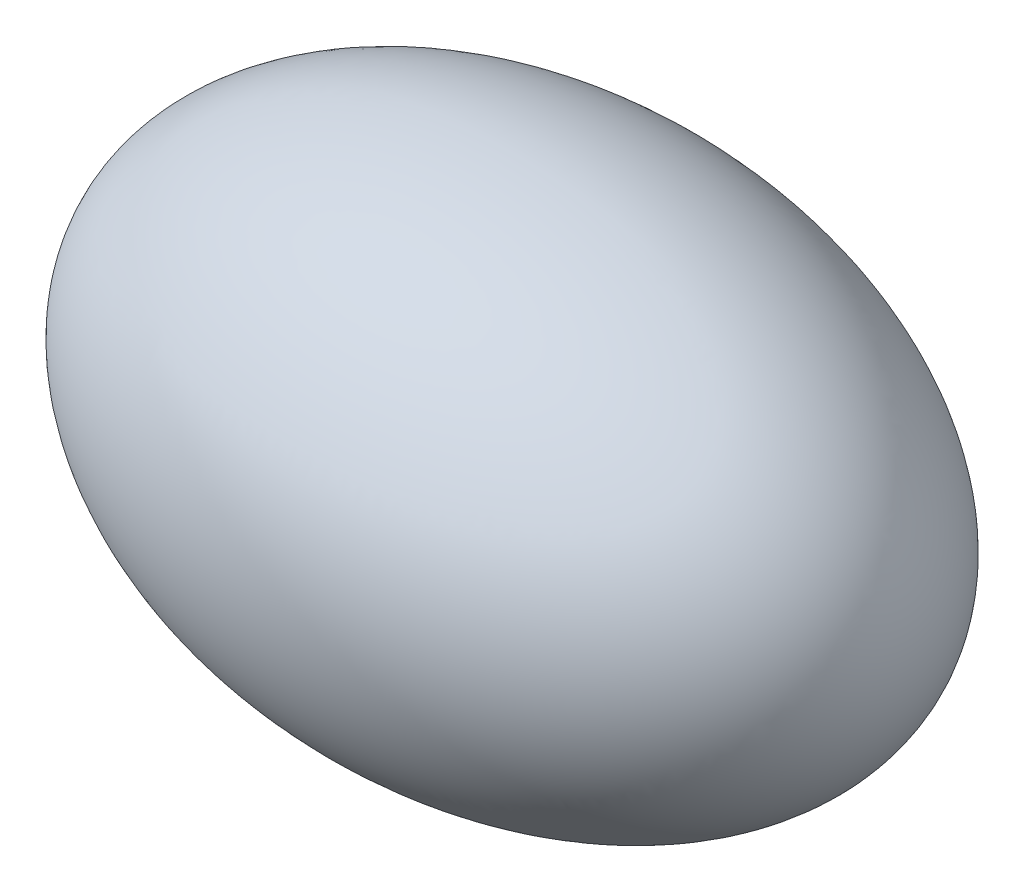
ISO-10303-21;
HEADER;
FILE_DESCRIPTION(('STEP AP214'),'2;1');
FILE_NAME('part.step','',(''),(''),'','','');
FILE_SCHEMA(('AUTOMOTIVE_DESIGN { 1 0 10303 214 1 1 1 1 }'));
ENDSEC;
DATA;
#1=APPLICATION_CONTEXT('core data for automotive mechanical design processes');
#2=APPLICATION_PROTOCOL_DEFINITION('international standard','automotive_design',2000,#1);
#3=PRODUCT_CONTEXT('',#1,'mechanical');
#4=PRODUCT('Part','Part','',(#3));
#5=PRODUCT_RELATED_PRODUCT_CATEGORY('part','',(#4));
#6=PRODUCT_DEFINITION_FORMATION('','',#4);
#7=PRODUCT_DEFINITION_CONTEXT('part definition',#1,'design');
#8=PRODUCT_DEFINITION('design','',#6,#7);
#9=PRODUCT_DEFINITION_SHAPE('','',#8);
#10=(LENGTH_UNIT() NAMED_UNIT(*) SI_UNIT(.MILLI.,.METRE.));
#11=(NAMED_UNIT(*) PLANE_ANGLE_UNIT() SI_UNIT($,.RADIAN.));
#12=(NAMED_UNIT(*) SI_UNIT($,.STERADIAN.) SOLID_ANGLE_UNIT());
#13=UNCERTAINTY_MEASURE_WITH_UNIT(LENGTH_MEASURE(1.E-05),#10,'distance_accuracy_value','');
#14=(GEOMETRIC_REPRESENTATION_CONTEXT(3) GLOBAL_UNCERTAINTY_ASSIGNED_CONTEXT((#13)) GLOBAL_UNIT_ASSIGNED_CONTEXT((#10,
#11,#12)) REPRESENTATION_CONTEXT('',''));
#15=CARTESIAN_POINT('',(0.,0.,0.));
#16=DIRECTION('',(0.,0.,1.));
#17=DIRECTION('',(1.,0.,0.));
#18=AXIS2_PLACEMENT_3D('',#15,#16,#17);
#19=CARTESIAN_POINT('',(0.,0.,0.));
#20=DIRECTION('',(0.,0.,1.));
#21=DIRECTION('',(1.,0.,0.));
#22=AXIS2_PLACEMENT_3D('',#19,#20,#21);
#23=ELLIPSE('',#22,129.54,85.09);
#24=TRIMMED_CURVE('',#23,(PARAMETER_VALUE(0.)),(PARAMETER_VALUE(3.14159265358979)),.T.,.PARAMETER.);
#25=CARTESIAN_POINT('',(-129.54,0.,0.));
#26=DIRECTION('',(-1.,0.,0.));
#27=AXIS1_PLACEMENT('',#25,#26);
#28=SURFACE_OF_REVOLUTION('',#24,#27);
#29=CARTESIAN_POINT('',(-129.54,0.,0.));
#30=VERTEX_POINT('',#29);
#31=VERTEX_LOOP('',#30);
#32=FACE_BOUND('',#31,.T.);
#33=CARTESIAN_POINT('',(129.54,0.,0.));
#34=VERTEX_POINT('',#33);
#35=VERTEX_LOOP('',#34);
#36=FACE_BOUND('',#35,.T.);
#37=ADVANCED_FACE('F40',(#32,#36),#28,.T.);
#38=CLOSED_SHELL('',(#37));
#39=MANIFOLD_SOLID_BREP('B2',#38);
#40=ADVANCED_BREP_SHAPE_REPRESENTATION('',(#18,#39),#14);
#41=SHAPE_DEFINITION_REPRESENTATION(#9,#40);
ENDSEC;
END-ISO-10303-21;
